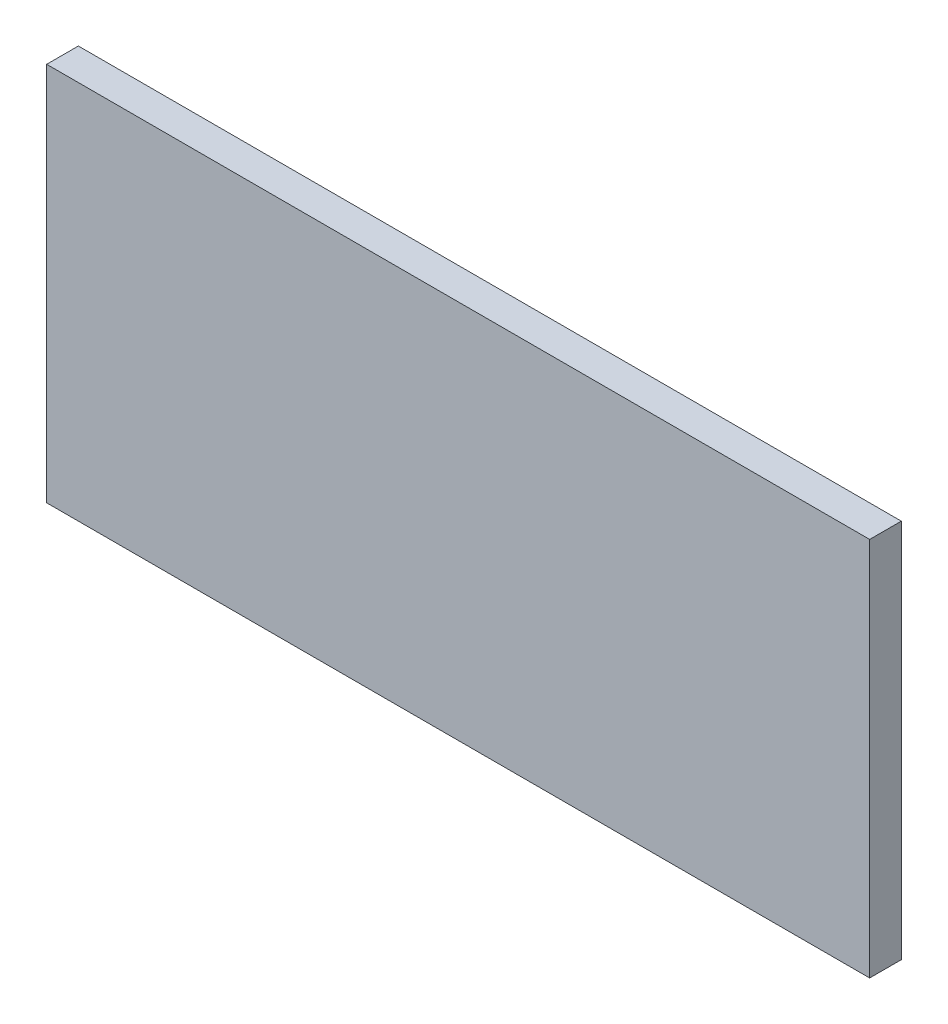
ISO-10303-21;
HEADER;
FILE_DESCRIPTION(('STEP AP214'),'2;1');
FILE_NAME('part.step','',(''),(''),'','','');
FILE_SCHEMA(('AUTOMOTIVE_DESIGN { 1 0 10303 214 1 1 1 1 }'));
ENDSEC;
DATA;
#1=APPLICATION_CONTEXT('core data for automotive mechanical design processes');
#2=APPLICATION_PROTOCOL_DEFINITION('international standard','automotive_design',2000,#1);
#3=PRODUCT_CONTEXT('',#1,'mechanical');
#4=PRODUCT('Part','Part','',(#3));
#5=PRODUCT_RELATED_PRODUCT_CATEGORY('part','',(#4));
#6=PRODUCT_DEFINITION_FORMATION('','',#4);
#7=PRODUCT_DEFINITION_CONTEXT('part definition',#1,'design');
#8=PRODUCT_DEFINITION('design','',#6,#7);
#9=PRODUCT_DEFINITION_SHAPE('','',#8);
#10=(LENGTH_UNIT() NAMED_UNIT(*) SI_UNIT(.MILLI.,.METRE.));
#11=(NAMED_UNIT(*) PLANE_ANGLE_UNIT() SI_UNIT($,.RADIAN.));
#12=(NAMED_UNIT(*) SI_UNIT($,.STERADIAN.) SOLID_ANGLE_UNIT());
#13=UNCERTAINTY_MEASURE_WITH_UNIT(LENGTH_MEASURE(1.E-05),#10,'distance_accuracy_value','');
#14=(GEOMETRIC_REPRESENTATION_CONTEXT(3) GLOBAL_UNCERTAINTY_ASSIGNED_CONTEXT((#13)) GLOBAL_UNIT_ASSIGNED_CONTEXT((#10,
#11,#12)) REPRESENTATION_CONTEXT('',''));
#15=CARTESIAN_POINT('',(0.,0.,0.));
#16=DIRECTION('',(0.,0.,1.));
#17=DIRECTION('',(1.,0.,0.));
#18=AXIS2_PLACEMENT_3D('',#15,#16,#17);
#19=CARTESIAN_POINT('',(82.55,-38.1,6.35));
#20=DIRECTION('',(-1.,0.,0.));
#21=DIRECTION('',(0.,0.,1.));
#22=AXIS2_PLACEMENT_3D('',#19,#20,#21);
#23=PLANE('',#22);
#24=DIRECTION('',(0.,1.,0.));
#25=VECTOR('',#24,1.);
#26=CARTESIAN_POINT('',(82.55,-38.1,0.));
#27=LINE('',#26,#25);
#28=CARTESIAN_POINT('',(82.55,-38.1,0.));
#29=VERTEX_POINT('',#28);
#30=CARTESIAN_POINT('',(82.55,38.1,0.));
#31=VERTEX_POINT('',#30);
#32=EDGE_CURVE('E98',#29,#31,#27,.T.);
#33=ORIENTED_EDGE('',*,*,#32,.T.);
#34=DIRECTION('',(0.,0.,-1.));
#35=VECTOR('',#34,1.);
#36=CARTESIAN_POINT('',(82.55,38.1,6.35));
#37=LINE('',#36,#35);
#38=CARTESIAN_POINT('',(82.55,38.1,6.35));
#39=VERTEX_POINT('',#38);
#40=EDGE_CURVE('E11',#39,#31,#37,.T.);
#41=ORIENTED_EDGE('',*,*,#40,.F.);
#42=DIRECTION('',(0.,1.,0.));
#43=VECTOR('',#42,1.);
#44=CARTESIAN_POINT('',(82.55,-38.1,6.35));
#45=LINE('',#44,#43);
#46=CARTESIAN_POINT('',(82.55,-38.1,6.35));
#47=VERTEX_POINT('',#46);
#48=EDGE_CURVE('E86',#47,#39,#45,.T.);
#49=ORIENTED_EDGE('',*,*,#48,.F.);
#50=DIRECTION('',(0.,0.,-1.));
#51=VECTOR('',#50,1.);
#52=CARTESIAN_POINT('',(82.55,-38.1,6.35));
#53=LINE('',#52,#51);
#54=EDGE_CURVE('E94',#47,#29,#53,.T.);
#55=ORIENTED_EDGE('',*,*,#54,.T.);
#56=EDGE_LOOP('',(#33,#41,#49,#55));
#57=FACE_BOUND('',#56,.T.);
#58=ADVANCED_FACE('F35',(#57),#23,.F.);
#59=CARTESIAN_POINT('',(-82.55,38.1,6.35));
#60=DIRECTION('',(0.,-1.,0.));
#61=DIRECTION('',(0.,0.,-1.));
#62=AXIS2_PLACEMENT_3D('',#59,#60,#61);
#63=PLANE('',#62);
#64=DIRECTION('',(-1.,0.,0.));
#65=VECTOR('',#64,1.);
#66=CARTESIAN_POINT('',(-82.55,38.1,0.));
#67=LINE('',#66,#65);
#68=CARTESIAN_POINT('',(-82.55,38.1,0.));
#69=VERTEX_POINT('',#68);
#70=EDGE_CURVE('E90',#31,#69,#67,.T.);
#71=ORIENTED_EDGE('',*,*,#70,.T.);
#72=DIRECTION('',(0.,0.,-1.));
#73=VECTOR('',#72,1.);
#74=CARTESIAN_POINT('',(-82.55,38.1,6.35));
#75=LINE('',#74,#73);
#76=CARTESIAN_POINT('',(-82.55,38.1,6.35));
#77=VERTEX_POINT('',#76);
#78=EDGE_CURVE('E43',#77,#69,#75,.T.);
#79=ORIENTED_EDGE('',*,*,#78,.F.);
#80=DIRECTION('',(-1.,0.,0.));
#81=VECTOR('',#80,1.);
#82=CARTESIAN_POINT('',(-82.55,38.1,6.35));
#83=LINE('',#82,#81);
#84=EDGE_CURVE('E81',#39,#77,#83,.T.);
#85=ORIENTED_EDGE('',*,*,#84,.F.);
#86=ORIENTED_EDGE('',*,*,#40,.T.);
#87=EDGE_LOOP('',(#71,#79,#85,#86));
#88=FACE_BOUND('',#87,.T.);
#89=ADVANCED_FACE('F89',(#88),#63,.F.);
#90=CARTESIAN_POINT('',(-82.55,-38.1,6.35));
#91=DIRECTION('',(1.,0.,0.));
#92=DIRECTION('',(0.,0.,-1.));
#93=AXIS2_PLACEMENT_3D('',#90,#91,#92);
#94=PLANE('',#93);
#95=DIRECTION('',(0.,-1.,0.));
#96=VECTOR('',#95,1.);
#97=CARTESIAN_POINT('',(-82.55,-38.1,0.));
#98=LINE('',#97,#96);
#99=CARTESIAN_POINT('',(-82.55,-38.1,0.));
#100=VERTEX_POINT('',#99);
#101=EDGE_CURVE('E68',#69,#100,#98,.T.);
#102=ORIENTED_EDGE('',*,*,#101,.T.);
#103=DIRECTION('',(0.,0.,-1.));
#104=VECTOR('',#103,1.);
#105=CARTESIAN_POINT('',(-82.55,-38.1,6.35));
#106=LINE('',#105,#104);
#107=CARTESIAN_POINT('',(-82.55,-38.1,6.35));
#108=VERTEX_POINT('',#107);
#109=EDGE_CURVE('E91',#108,#100,#106,.T.);
#110=ORIENTED_EDGE('',*,*,#109,.F.);
#111=DIRECTION('',(0.,-1.,0.));
#112=VECTOR('',#111,1.);
#113=CARTESIAN_POINT('',(-82.55,-38.1,6.35));
#114=LINE('',#113,#112);
#115=EDGE_CURVE('E84',#77,#108,#114,.T.);
#116=ORIENTED_EDGE('',*,*,#115,.F.);
#117=ORIENTED_EDGE('',*,*,#78,.T.);
#118=EDGE_LOOP('',(#102,#110,#116,#117));
#119=FACE_BOUND('',#118,.T.);
#120=ADVANCED_FACE('F92',(#119),#94,.F.);
#121=CARTESIAN_POINT('',(-82.55,-38.1,6.35));
#122=DIRECTION('',(0.,1.,0.));
#123=DIRECTION('',(0.,0.,1.));
#124=AXIS2_PLACEMENT_3D('',#121,#122,#123);
#125=PLANE('',#124);
#126=DIRECTION('',(1.,0.,0.));
#127=VECTOR('',#126,1.);
#128=CARTESIAN_POINT('',(-82.55,-38.1,0.));
#129=LINE('',#128,#127);
#130=EDGE_CURVE('E74',#100,#29,#129,.T.);
#131=ORIENTED_EDGE('',*,*,#130,.T.);
#132=ORIENTED_EDGE('',*,*,#54,.F.);
#133=DIRECTION('',(1.,0.,0.));
#134=VECTOR('',#133,1.);
#135=CARTESIAN_POINT('',(-82.55,-38.1,6.35));
#136=LINE('',#135,#134);
#137=EDGE_CURVE('E51',#108,#47,#136,.T.);
#138=ORIENTED_EDGE('',*,*,#137,.F.);
#139=ORIENTED_EDGE('',*,*,#109,.T.);
#140=EDGE_LOOP('',(#131,#132,#138,#139));
#141=FACE_BOUND('',#140,.T.);
#142=ADVANCED_FACE('F105',(#141),#125,.F.);
#143=CARTESIAN_POINT('',(0.,0.,6.35));
#144=DIRECTION('',(0.,0.,-1.));
#145=DIRECTION('',(-1.,0.,0.));
#146=AXIS2_PLACEMENT_3D('',#143,#144,#145);
#147=PLANE('',#146);
#148=ORIENTED_EDGE('',*,*,#48,.T.);
#149=ORIENTED_EDGE('',*,*,#84,.T.);
#150=ORIENTED_EDGE('',*,*,#115,.T.);
#151=ORIENTED_EDGE('',*,*,#137,.T.);
#152=EDGE_LOOP('',(#148,#149,#150,#151));
#153=FACE_BOUND('',#152,.T.);
#154=ADVANCED_FACE('F82',(#153),#147,.F.);
#155=CARTESIAN_POINT('',(0.,0.,0.));
#156=DIRECTION('',(0.,0.,-1.));
#157=DIRECTION('',(-1.,0.,0.));
#158=AXIS2_PLACEMENT_3D('',#155,#156,#157);
#159=PLANE('',#158);
#160=ORIENTED_EDGE('',*,*,#32,.F.);
#161=ORIENTED_EDGE('',*,*,#130,.F.);
#162=ORIENTED_EDGE('',*,*,#101,.F.);
#163=ORIENTED_EDGE('',*,*,#70,.F.);
#164=EDGE_LOOP('',(#160,#161,#162,#163));
#165=FACE_BOUND('',#164,.T.);
#166=ADVANCED_FACE('F108',(#165),#159,.T.);
#167=CLOSED_SHELL('',(#58,#89,#120,#142,#154,#166));
#168=MANIFOLD_SOLID_BREP('B2',#167);
#169=ADVANCED_BREP_SHAPE_REPRESENTATION('',(#18,#168),#14);
#170=SHAPE_DEFINITION_REPRESENTATION(#9,#169);
ENDSEC;
END-ISO-10303-21;
